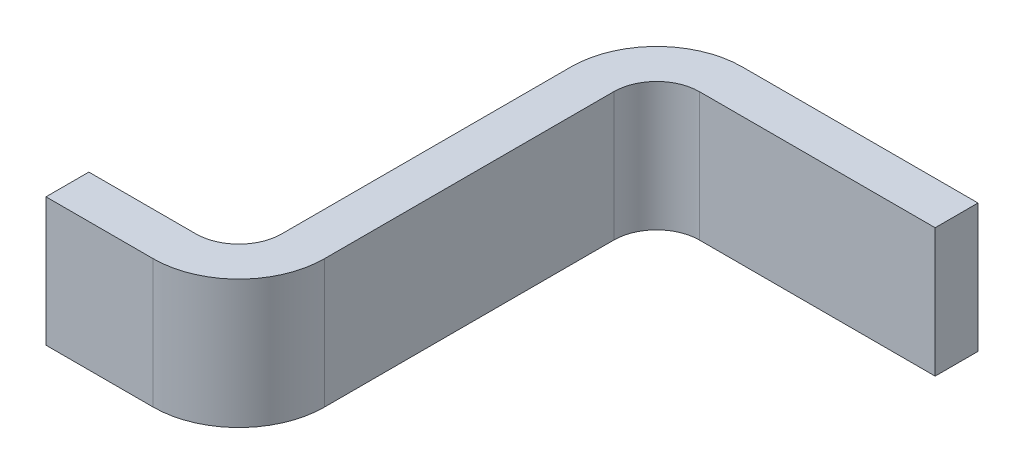
ISO-10303-21;
HEADER;
FILE_DESCRIPTION(('STEP AP214'),'2;1');
FILE_NAME('part.step','',(''),(''),'','','');
FILE_SCHEMA(('AUTOMOTIVE_DESIGN { 1 0 10303 214 1 1 1 1 }'));
ENDSEC;
DATA;
#1=APPLICATION_CONTEXT('core data for automotive mechanical design processes');
#2=APPLICATION_PROTOCOL_DEFINITION('international standard','automotive_design',2000,#1);
#3=PRODUCT_CONTEXT('',#1,'mechanical');
#4=PRODUCT('Part','Part','',(#3));
#5=PRODUCT_RELATED_PRODUCT_CATEGORY('part','',(#4));
#6=PRODUCT_DEFINITION_FORMATION('','',#4);
#7=PRODUCT_DEFINITION_CONTEXT('part definition',#1,'design');
#8=PRODUCT_DEFINITION('design','',#6,#7);
#9=PRODUCT_DEFINITION_SHAPE('','',#8);
#10=(LENGTH_UNIT() NAMED_UNIT(*) SI_UNIT(.MILLI.,.METRE.));
#11=(NAMED_UNIT(*) PLANE_ANGLE_UNIT() SI_UNIT($,.RADIAN.));
#12=(NAMED_UNIT(*) SI_UNIT($,.STERADIAN.) SOLID_ANGLE_UNIT());
#13=UNCERTAINTY_MEASURE_WITH_UNIT(LENGTH_MEASURE(1.E-05),#10,'distance_accuracy_value','');
#14=(GEOMETRIC_REPRESENTATION_CONTEXT(3) GLOBAL_UNCERTAINTY_ASSIGNED_CONTEXT((#13)) GLOBAL_UNIT_ASSIGNED_CONTEXT((#10,
#11,#12)) REPRESENTATION_CONTEXT('',''));
#15=CARTESIAN_POINT('',(0.,0.,0.));
#16=DIRECTION('',(0.,0.,1.));
#17=DIRECTION('',(1.,0.,0.));
#18=AXIS2_PLACEMENT_3D('',#15,#16,#17);
#19=CARTESIAN_POINT('',(0.,0.15,1.075));
#20=DIRECTION('',(0.,0.,-1.));
#21=DIRECTION('',(-1.,0.,0.));
#22=AXIS2_PLACEMENT_3D('',#19,#20,#21);
#23=PLANE('',#22);
#24=DIRECTION('',(1.,0.,0.));
#25=VECTOR('',#24,1.);
#26=CARTESIAN_POINT('',(0.,0.15,1.075));
#27=LINE('',#26,#25);
#28=CARTESIAN_POINT('',(0.25,0.15,1.075));
#29=VERTEX_POINT('',#28);
#30=CARTESIAN_POINT('',(0.,0.15,1.075));
#31=VERTEX_POINT('',#30);
#32=EDGE_CURVE('E85',#29,#31,#27,.F.);
#33=ORIENTED_EDGE('',*,*,#32,.T.);
#34=DIRECTION('',(0.,1.,0.));
#35=VECTOR('',#34,1.);
#36=CARTESIAN_POINT('',(0.,-0.15,1.075));
#37=LINE('',#36,#35);
#38=CARTESIAN_POINT('',(0.,-0.15,1.075));
#39=VERTEX_POINT('',#38);
#40=EDGE_CURVE('E111',#39,#31,#37,.T.);
#41=ORIENTED_EDGE('',*,*,#40,.F.);
#42=DIRECTION('',(1.,0.,0.));
#43=VECTOR('',#42,1.);
#44=CARTESIAN_POINT('',(0.,-0.15,1.075));
#45=LINE('',#44,#43);
#46=CARTESIAN_POINT('',(0.25,-0.15,1.075));
#47=VERTEX_POINT('',#46);
#48=EDGE_CURVE('E130',#39,#47,#45,.T.);
#49=ORIENTED_EDGE('',*,*,#48,.T.);
#50=DIRECTION('',(0.,1.,0.));
#51=VECTOR('',#50,1.);
#52=CARTESIAN_POINT('',(0.25,0.15,1.075));
#53=LINE('',#52,#51);
#54=EDGE_CURVE('E121',#29,#47,#53,.F.);
#55=ORIENTED_EDGE('',*,*,#54,.F.);
#56=EDGE_LOOP('',(#33,#41,#49,#55));
#57=FACE_BOUND('',#56,.T.);
#58=ADVANCED_FACE('F17',(#57),#23,.F.);
#59=CARTESIAN_POINT('',(0.55,0.15,0.1));
#60=DIRECTION('',(0.,0.,-1.));
#61=DIRECTION('',(-1.,0.,0.));
#62=AXIS2_PLACEMENT_3D('',#59,#60,#61);
#63=PLANE('',#62);
#64=DIRECTION('',(1.,0.,0.));
#65=VECTOR('',#64,1.);
#66=CARTESIAN_POINT('',(0.55,0.15,0.1));
#67=LINE('',#66,#65);
#68=CARTESIAN_POINT('',(1.1,0.15,0.1));
#69=VERTEX_POINT('',#68);
#70=CARTESIAN_POINT('',(0.55,0.15,0.1));
#71=VERTEX_POINT('',#70);
#72=EDGE_CURVE('E142',#69,#71,#67,.F.);
#73=ORIENTED_EDGE('',*,*,#72,.T.);
#74=DIRECTION('',(0.,-1.,0.));
#75=VECTOR('',#74,1.);
#76=CARTESIAN_POINT('',(0.55,0.15,0.1));
#77=LINE('',#76,#75);
#78=CARTESIAN_POINT('',(0.55,-0.15,0.1));
#79=VERTEX_POINT('',#78);
#80=EDGE_CURVE('E189',#71,#79,#77,.T.);
#81=ORIENTED_EDGE('',*,*,#80,.T.);
#82=DIRECTION('',(1.,0.,0.));
#83=VECTOR('',#82,1.);
#84=CARTESIAN_POINT('',(0.55,-0.15,0.1));
#85=LINE('',#84,#83);
#86=CARTESIAN_POINT('',(1.1,-0.15,0.1));
#87=VERTEX_POINT('',#86);
#88=EDGE_CURVE('E193',#79,#87,#85,.T.);
#89=ORIENTED_EDGE('',*,*,#88,.T.);
#90=DIRECTION('',(0.,1.,0.));
#91=VECTOR('',#90,1.);
#92=CARTESIAN_POINT('',(1.1,-0.15,0.1));
#93=LINE('',#92,#91);
#94=EDGE_CURVE('E96',#87,#69,#93,.T.);
#95=ORIENTED_EDGE('',*,*,#94,.T.);
#96=EDGE_LOOP('',(#73,#81,#89,#95));
#97=FACE_BOUND('',#96,.T.);
#98=ADVANCED_FACE('F230',(#97),#63,.F.);
#99=CARTESIAN_POINT('',(0.,-0.15,0.975));
#100=DIRECTION('',(-1.,0.,0.));
#101=DIRECTION('',(0.,0.,1.));
#102=AXIS2_PLACEMENT_3D('',#99,#100,#101);
#103=PLANE('',#102);
#104=DIRECTION('',(0.,0.,1.));
#105=VECTOR('',#104,1.);
#106=CARTESIAN_POINT('',(0.,0.15,0.975));
#107=LINE('',#106,#105);
#108=CARTESIAN_POINT('',(0.,0.15,0.975));
#109=VERTEX_POINT('',#108);
#110=EDGE_CURVE('E114',#31,#109,#107,.F.);
#111=ORIENTED_EDGE('',*,*,#110,.T.);
#112=DIRECTION('',(0.,1.,0.));
#113=VECTOR('',#112,1.);
#114=CARTESIAN_POINT('',(0.,-0.15,0.975));
#115=LINE('',#114,#113);
#116=CARTESIAN_POINT('',(0.,-0.15,0.975));
#117=VERTEX_POINT('',#116);
#118=EDGE_CURVE('E175',#109,#117,#115,.F.);
#119=ORIENTED_EDGE('',*,*,#118,.T.);
#120=DIRECTION('',(0.,0.,1.));
#121=VECTOR('',#120,1.);
#122=CARTESIAN_POINT('',(0.,-0.15,1.075));
#123=LINE('',#122,#121);
#124=EDGE_CURVE('E116',#117,#39,#123,.T.);
#125=ORIENTED_EDGE('',*,*,#124,.T.);
#126=ORIENTED_EDGE('',*,*,#40,.T.);
#127=EDGE_LOOP('',(#111,#119,#125,#126));
#128=FACE_BOUND('',#127,.T.);
#129=ADVANCED_FACE('F112',(#128),#103,.T.);
#130=CARTESIAN_POINT('',(0.25,0.15,0.875));
#131=DIRECTION('',(0.,1.,0.));
#132=DIRECTION('',(0.,0.,1.));
#133=AXIS2_PLACEMENT_3D('',#130,#131,#132);
#134=CYLINDRICAL_SURFACE('',#133,0.2);
#135=CARTESIAN_POINT('',(0.25,0.15,0.875));
#136=DIRECTION('',(0.,1.,0.));
#137=DIRECTION('',(0.,0.,1.));
#138=AXIS2_PLACEMENT_3D('',#135,#136,#137);
#139=CIRCLE('',#138,0.2);
#140=CARTESIAN_POINT('',(0.45,0.15,0.875));
#141=VERTEX_POINT('',#140);
#142=EDGE_CURVE('E20',#29,#141,#139,.T.);
#143=ORIENTED_EDGE('',*,*,#142,.F.);
#144=ORIENTED_EDGE('',*,*,#54,.T.);
#145=CARTESIAN_POINT('',(0.25,-0.15,0.875));
#146=DIRECTION('',(0.,1.,0.));
#147=DIRECTION('',(0.,0.,1.));
#148=AXIS2_PLACEMENT_3D('',#145,#146,#147);
#149=CIRCLE('',#148,0.2);
#150=CARTESIAN_POINT('',(0.45,-0.15,0.875));
#151=VERTEX_POINT('',#150);
#152=EDGE_CURVE('E166',#151,#47,#149,.F.);
#153=ORIENTED_EDGE('',*,*,#152,.F.);
#154=DIRECTION('',(0.,1.,0.));
#155=VECTOR('',#154,1.);
#156=CARTESIAN_POINT('',(0.45,0.15,0.875));
#157=LINE('',#156,#155);
#158=EDGE_CURVE('E168',#151,#141,#157,.T.);
#159=ORIENTED_EDGE('',*,*,#158,.T.);
#160=EDGE_LOOP('',(#143,#144,#153,#159));
#161=FACE_BOUND('',#160,.T.);
#162=ADVANCED_FACE('F220',(#161),#134,.T.);
#163=CARTESIAN_POINT('',(1.1,-0.15,0.));
#164=DIRECTION('',(-1.,0.,0.));
#165=DIRECTION('',(0.,0.,1.));
#166=AXIS2_PLACEMENT_3D('',#163,#164,#165);
#167=PLANE('',#166);
#168=DIRECTION('',(0.,0.,1.));
#169=VECTOR('',#168,1.);
#170=CARTESIAN_POINT('',(1.1,0.15,0.));
#171=LINE('',#170,#169);
#172=CARTESIAN_POINT('',(1.1,0.15,0.));
#173=VERTEX_POINT('',#172);
#174=EDGE_CURVE('E141',#69,#173,#171,.F.);
#175=ORIENTED_EDGE('',*,*,#174,.F.);
#176=ORIENTED_EDGE('',*,*,#94,.F.);
#177=DIRECTION('',(0.,0.,1.));
#178=VECTOR('',#177,1.);
#179=CARTESIAN_POINT('',(1.1,-0.15,0.1));
#180=LINE('',#179,#178);
#181=CARTESIAN_POINT('',(1.1,-0.15,0.));
#182=VERTEX_POINT('',#181);
#183=EDGE_CURVE('E192',#87,#182,#180,.F.);
#184=ORIENTED_EDGE('',*,*,#183,.T.);
#185=DIRECTION('',(0.,1.,0.));
#186=VECTOR('',#185,1.);
#187=CARTESIAN_POINT('',(1.1,-0.15,0.));
#188=LINE('',#187,#186);
#189=EDGE_CURVE('E161',#182,#173,#188,.T.);
#190=ORIENTED_EDGE('',*,*,#189,.T.);
#191=EDGE_LOOP('',(#175,#176,#184,#190));
#192=FACE_BOUND('',#191,.T.);
#193=ADVANCED_FACE('F232',(#192),#167,.F.);
#194=CARTESIAN_POINT('',(0.55,0.15,0.2));
#195=DIRECTION('',(0.,-1.,0.));
#196=DIRECTION('',(0.,0.,-1.));
#197=AXIS2_PLACEMENT_3D('',#194,#195,#196);
#198=CYLINDRICAL_SURFACE('',#197,0.1);
#199=CARTESIAN_POINT('',(0.55,0.15,0.2));
#200=DIRECTION('',(0.,-1.,0.));
#201=DIRECTION('',(0.,0.,-1.));
#202=AXIS2_PLACEMENT_3D('',#199,#200,#201);
#203=CIRCLE('',#202,0.1);
#204=CARTESIAN_POINT('',(0.45,0.15,0.2));
#205=VERTEX_POINT('',#204);
#206=EDGE_CURVE('E162',#205,#71,#203,.T.);
#207=ORIENTED_EDGE('',*,*,#206,.F.);
#208=DIRECTION('',(0.,1.,0.));
#209=VECTOR('',#208,1.);
#210=CARTESIAN_POINT('',(0.45,0.15,0.2));
#211=LINE('',#210,#209);
#212=CARTESIAN_POINT('',(0.45,-0.15,0.2));
#213=VERTEX_POINT('',#212);
#214=EDGE_CURVE('E165',#205,#213,#211,.F.);
#215=ORIENTED_EDGE('',*,*,#214,.T.);
#216=CARTESIAN_POINT('',(0.55,-0.15,0.2));
#217=DIRECTION('',(0.,-1.,0.));
#218=DIRECTION('',(0.,0.,-1.));
#219=AXIS2_PLACEMENT_3D('',#216,#217,#218);
#220=CIRCLE('',#219,0.1);
#221=EDGE_CURVE('E159',#79,#213,#220,.F.);
#222=ORIENTED_EDGE('',*,*,#221,.F.);
#223=ORIENTED_EDGE('',*,*,#80,.F.);
#224=EDGE_LOOP('',(#207,#215,#222,#223));
#225=FACE_BOUND('',#224,.T.);
#226=ADVANCED_FACE('F226',(#225),#198,.F.);
#227=CARTESIAN_POINT('',(0.,-0.15,0.975));
#228=DIRECTION('',(0.,0.,1.));
#229=DIRECTION('',(1.,0.,0.));
#230=AXIS2_PLACEMENT_3D('',#227,#228,#229);
#231=PLANE('',#230);
#232=DIRECTION('',(1.,0.,0.));
#233=VECTOR('',#232,1.);
#234=CARTESIAN_POINT('',(0.,-0.15,0.975));
#235=LINE('',#234,#233);
#236=CARTESIAN_POINT('',(0.25,-0.15,0.975));
#237=VERTEX_POINT('',#236);
#238=EDGE_CURVE('E169',#117,#237,#235,.T.);
#239=ORIENTED_EDGE('',*,*,#238,.F.);
#240=ORIENTED_EDGE('',*,*,#118,.F.);
#241=DIRECTION('',(1.,0.,0.));
#242=VECTOR('',#241,1.);
#243=CARTESIAN_POINT('',(0.,0.15,0.975));
#244=LINE('',#243,#242);
#245=CARTESIAN_POINT('',(0.25,0.15,0.975));
#246=VERTEX_POINT('',#245);
#247=EDGE_CURVE('E128',#246,#109,#244,.F.);
#248=ORIENTED_EDGE('',*,*,#247,.F.);
#249=DIRECTION('',(0.,1.,0.));
#250=VECTOR('',#249,1.);
#251=CARTESIAN_POINT('',(0.25,-0.15,0.975));
#252=LINE('',#251,#250);
#253=EDGE_CURVE('E155',#246,#237,#252,.F.);
#254=ORIENTED_EDGE('',*,*,#253,.T.);
#255=EDGE_LOOP('',(#239,#240,#248,#254));
#256=FACE_BOUND('',#255,.T.);
#257=ADVANCED_FACE('F266',(#256),#231,.F.);
#258=CARTESIAN_POINT('',(0.45,0.15,0.875));
#259=DIRECTION('',(-1.,0.,0.));
#260=DIRECTION('',(0.,0.,1.));
#261=AXIS2_PLACEMENT_3D('',#258,#259,#260);
#262=PLANE('',#261);
#263=DIRECTION('',(0.,0.,-1.));
#264=VECTOR('',#263,1.);
#265=CARTESIAN_POINT('',(0.45,0.15,0.875));
#266=LINE('',#265,#264);
#267=EDGE_CURVE('E158',#205,#141,#266,.F.);
#268=ORIENTED_EDGE('',*,*,#267,.T.);
#269=ORIENTED_EDGE('',*,*,#158,.F.);
#270=DIRECTION('',(0.,0.,1.));
#271=VECTOR('',#270,1.);
#272=CARTESIAN_POINT('',(0.45,-0.15,0.875));
#273=LINE('',#272,#271);
#274=EDGE_CURVE('E152',#151,#213,#273,.F.);
#275=ORIENTED_EDGE('',*,*,#274,.T.);
#276=ORIENTED_EDGE('',*,*,#214,.F.);
#277=EDGE_LOOP('',(#268,#269,#275,#276));
#278=FACE_BOUND('',#277,.T.);
#279=ADVANCED_FACE('F268',(#278),#262,.F.);
#280=CARTESIAN_POINT('',(0.55,-0.15,0.));
#281=DIRECTION('',(0.,0.,1.));
#282=DIRECTION('',(1.,0.,0.));
#283=AXIS2_PLACEMENT_3D('',#280,#281,#282);
#284=PLANE('',#283);
#285=DIRECTION('',(1.,0.,0.));
#286=VECTOR('',#285,1.);
#287=CARTESIAN_POINT('',(0.55,-0.15,0.));
#288=LINE('',#287,#286);
#289=CARTESIAN_POINT('',(0.55,-0.15,0.));
#290=VERTEX_POINT('',#289);
#291=EDGE_CURVE('E203',#290,#182,#288,.T.);
#292=ORIENTED_EDGE('',*,*,#291,.F.);
#293=DIRECTION('',(0.,-1.,0.));
#294=VECTOR('',#293,1.);
#295=CARTESIAN_POINT('',(0.55,-0.15,0.));
#296=LINE('',#295,#294);
#297=CARTESIAN_POINT('',(0.55,0.15,0.));
#298=VERTEX_POINT('',#297);
#299=EDGE_CURVE('E149',#298,#290,#296,.T.);
#300=ORIENTED_EDGE('',*,*,#299,.F.);
#301=DIRECTION('',(1.,0.,0.));
#302=VECTOR('',#301,1.);
#303=CARTESIAN_POINT('',(0.55,0.15,0.));
#304=LINE('',#303,#302);
#305=EDGE_CURVE('E164',#173,#298,#304,.F.);
#306=ORIENTED_EDGE('',*,*,#305,.F.);
#307=ORIENTED_EDGE('',*,*,#189,.F.);
#308=EDGE_LOOP('',(#292,#300,#306,#307));
#309=FACE_BOUND('',#308,.T.);
#310=ADVANCED_FACE('F238',(#309),#284,.F.);
#311=CARTESIAN_POINT('',(0.35,0.15,0.875));
#312=DIRECTION('',(0.,-1.,0.));
#313=DIRECTION('',(0.,0.,-1.));
#314=AXIS2_PLACEMENT_3D('',#311,#312,#313);
#315=PLANE('',#314);
#316=DIRECTION('',(0.,0.,-1.));
#317=VECTOR('',#316,1.);
#318=CARTESIAN_POINT('',(0.35,0.15,0.875));
#319=LINE('',#318,#317);
#320=CARTESIAN_POINT('',(0.35,0.15,0.2));
#321=VERTEX_POINT('',#320);
#322=CARTESIAN_POINT('',(0.35,0.15,0.875));
#323=VERTEX_POINT('',#322);
#324=EDGE_CURVE('E148',#321,#323,#319,.F.);
#325=ORIENTED_EDGE('',*,*,#324,.T.);
#326=CARTESIAN_POINT('',(0.25,0.15,0.875));
#327=DIRECTION('',(0.,1.,0.));
#328=DIRECTION('',(0.,0.,1.));
#329=AXIS2_PLACEMENT_3D('',#326,#327,#328);
#330=CIRCLE('',#329,0.1);
#331=EDGE_CURVE('E156',#323,#246,#330,.F.);
#332=ORIENTED_EDGE('',*,*,#331,.T.);
#333=ORIENTED_EDGE('',*,*,#247,.T.);
#334=ORIENTED_EDGE('',*,*,#110,.F.);
#335=ORIENTED_EDGE('',*,*,#32,.F.);
#336=ORIENTED_EDGE('',*,*,#142,.T.);
#337=ORIENTED_EDGE('',*,*,#267,.F.);
#338=ORIENTED_EDGE('',*,*,#206,.T.);
#339=ORIENTED_EDGE('',*,*,#72,.F.);
#340=ORIENTED_EDGE('',*,*,#174,.T.);
#341=ORIENTED_EDGE('',*,*,#305,.T.);
#342=CARTESIAN_POINT('',(0.55,0.15,0.2));
#343=DIRECTION('',(0.,-1.,0.));
#344=DIRECTION('',(0.,0.,-1.));
#345=AXIS2_PLACEMENT_3D('',#342,#343,#344);
#346=CIRCLE('',#345,0.2);
#347=EDGE_CURVE('E150',#321,#298,#346,.T.);
#348=ORIENTED_EDGE('',*,*,#347,.F.);
#349=EDGE_LOOP('',(#325,#332,#333,#334,#335,#336,#337,#338,#339,#340,#341,#348));
#350=FACE_BOUND('',#349,.T.);
#351=ADVANCED_FACE('F126',(#350),#315,.F.);
#352=CARTESIAN_POINT('',(0.25,-0.15,0.875));
#353=DIRECTION('',(0.,1.,0.));
#354=DIRECTION('',(0.,0.,1.));
#355=AXIS2_PLACEMENT_3D('',#352,#353,#354);
#356=CYLINDRICAL_SURFACE('',#355,0.1);
#357=CARTESIAN_POINT('',(0.25,-0.15,0.875));
#358=DIRECTION('',(0.,1.,0.));
#359=DIRECTION('',(0.,0.,1.));
#360=AXIS2_PLACEMENT_3D('',#357,#358,#359);
#361=CIRCLE('',#360,0.1);
#362=CARTESIAN_POINT('',(0.35,-0.15,0.875));
#363=VERTEX_POINT('',#362);
#364=EDGE_CURVE('E153',#237,#363,#361,.T.);
#365=ORIENTED_EDGE('',*,*,#364,.F.);
#366=ORIENTED_EDGE('',*,*,#253,.F.);
#367=ORIENTED_EDGE('',*,*,#331,.F.);
#368=DIRECTION('',(0.,1.,0.));
#369=VECTOR('',#368,1.);
#370=CARTESIAN_POINT('',(0.35,-0.15,0.875));
#371=LINE('',#370,#369);
#372=EDGE_CURVE('E251',#323,#363,#371,.F.);
#373=ORIENTED_EDGE('',*,*,#372,.T.);
#374=EDGE_LOOP('',(#365,#366,#367,#373));
#375=FACE_BOUND('',#374,.T.);
#376=ADVANCED_FACE('F263',(#375),#356,.F.);
#377=CARTESIAN_POINT('',(0.45,-0.15,0.875));
#378=DIRECTION('',(0.,1.,0.));
#379=DIRECTION('',(0.,0.,1.));
#380=AXIS2_PLACEMENT_3D('',#377,#378,#379);
#381=PLANE('',#380);
#382=ORIENTED_EDGE('',*,*,#274,.F.);
#383=ORIENTED_EDGE('',*,*,#152,.T.);
#384=ORIENTED_EDGE('',*,*,#48,.F.);
#385=ORIENTED_EDGE('',*,*,#124,.F.);
#386=ORIENTED_EDGE('',*,*,#238,.T.);
#387=ORIENTED_EDGE('',*,*,#364,.T.);
#388=DIRECTION('',(0.,0.,-1.));
#389=VECTOR('',#388,1.);
#390=CARTESIAN_POINT('',(0.35,-0.15,0.875));
#391=LINE('',#390,#389);
#392=CARTESIAN_POINT('',(0.35,-0.15,0.2));
#393=VERTEX_POINT('',#392);
#394=EDGE_CURVE('E26',#363,#393,#391,.T.);
#395=ORIENTED_EDGE('',*,*,#394,.T.);
#396=CARTESIAN_POINT('',(0.55,-0.15,0.2));
#397=DIRECTION('',(0.,-1.,0.));
#398=DIRECTION('',(0.,0.,-1.));
#399=AXIS2_PLACEMENT_3D('',#396,#397,#398);
#400=CIRCLE('',#399,0.2);
#401=EDGE_CURVE('E34',#290,#393,#400,.F.);
#402=ORIENTED_EDGE('',*,*,#401,.F.);
#403=ORIENTED_EDGE('',*,*,#291,.T.);
#404=ORIENTED_EDGE('',*,*,#183,.F.);
#405=ORIENTED_EDGE('',*,*,#88,.F.);
#406=ORIENTED_EDGE('',*,*,#221,.T.);
#407=EDGE_LOOP('',(#382,#383,#384,#385,#386,#387,#395,#402,#403,#404,#405,#406));
#408=FACE_BOUND('',#407,.T.);
#409=ADVANCED_FACE('F240',(#408),#381,.F.);
#410=CARTESIAN_POINT('',(0.55,-0.15,0.2));
#411=DIRECTION('',(0.,-1.,0.));
#412=DIRECTION('',(0.,0.,-1.));
#413=AXIS2_PLACEMENT_3D('',#410,#411,#412);
#414=CYLINDRICAL_SURFACE('',#413,0.2);
#415=ORIENTED_EDGE('',*,*,#401,.T.);
#416=DIRECTION('',(0.,1.,0.));
#417=VECTOR('',#416,1.);
#418=CARTESIAN_POINT('',(0.35,-0.15,0.2));
#419=LINE('',#418,#417);
#420=EDGE_CURVE('E11',#393,#321,#419,.T.);
#421=ORIENTED_EDGE('',*,*,#420,.T.);
#422=ORIENTED_EDGE('',*,*,#347,.T.);
#423=ORIENTED_EDGE('',*,*,#299,.T.);
#424=EDGE_LOOP('',(#415,#421,#422,#423));
#425=FACE_BOUND('',#424,.T.);
#426=ADVANCED_FACE('F260',(#425),#414,.T.);
#427=CARTESIAN_POINT('',(0.35,-0.15,0.875));
#428=DIRECTION('',(1.,0.,0.));
#429=DIRECTION('',(0.,0.,-1.));
#430=AXIS2_PLACEMENT_3D('',#427,#428,#429);
#431=PLANE('',#430);
#432=ORIENTED_EDGE('',*,*,#394,.F.);
#433=ORIENTED_EDGE('',*,*,#372,.F.);
#434=ORIENTED_EDGE('',*,*,#324,.F.);
#435=ORIENTED_EDGE('',*,*,#420,.F.);
#436=EDGE_LOOP('',(#432,#433,#434,#435));
#437=FACE_BOUND('',#436,.T.);
#438=ADVANCED_FACE('F258',(#437),#431,.F.);
#439=CLOSED_SHELL('',(#58,#98,#129,#162,#193,#226,#257,#279,#310,#351,#376,#409,#426,#438));
#440=MANIFOLD_SOLID_BREP('B1',#439);
#441=ADVANCED_BREP_SHAPE_REPRESENTATION('',(#18,#440),#14);
#442=SHAPE_DEFINITION_REPRESENTATION(#9,#441);
ENDSEC;
END-ISO-10303-21;
